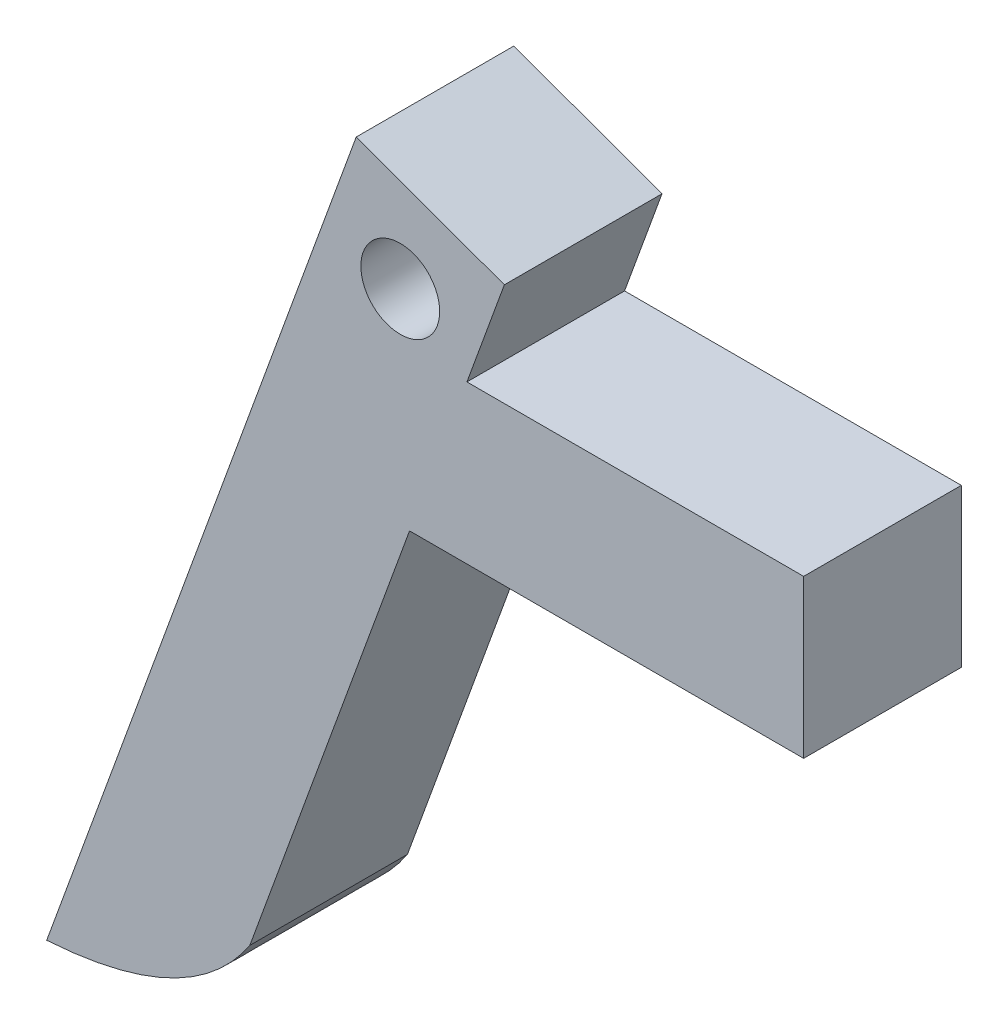
ISO-10303-21;
HEADER;
FILE_DESCRIPTION(('STEP AP214'),'2;1');
FILE_NAME('part.step','',(''),(''),'','','');
FILE_SCHEMA(('AUTOMOTIVE_DESIGN { 1 0 10303 214 1 1 1 1 }'));
ENDSEC;
DATA;
#1=APPLICATION_CONTEXT('core data for automotive mechanical design processes');
#2=APPLICATION_PROTOCOL_DEFINITION('international standard','automotive_design',2000,#1);
#3=PRODUCT_CONTEXT('',#1,'mechanical');
#4=PRODUCT('Part','Part','',(#3));
#5=PRODUCT_RELATED_PRODUCT_CATEGORY('part','',(#4));
#6=PRODUCT_DEFINITION_FORMATION('','',#4);
#7=PRODUCT_DEFINITION_CONTEXT('part definition',#1,'design');
#8=PRODUCT_DEFINITION('design','',#6,#7);
#9=PRODUCT_DEFINITION_SHAPE('','',#8);
#10=(LENGTH_UNIT() NAMED_UNIT(*) SI_UNIT(.MILLI.,.METRE.));
#11=(NAMED_UNIT(*) PLANE_ANGLE_UNIT() SI_UNIT($,.RADIAN.));
#12=(NAMED_UNIT(*) SI_UNIT($,.STERADIAN.) SOLID_ANGLE_UNIT());
#13=UNCERTAINTY_MEASURE_WITH_UNIT(LENGTH_MEASURE(1.E-05),#10,'distance_accuracy_value','');
#14=(GEOMETRIC_REPRESENTATION_CONTEXT(3) GLOBAL_UNCERTAINTY_ASSIGNED_CONTEXT((#13)) GLOBAL_UNIT_ASSIGNED_CONTEXT((#10,
#11,#12)) REPRESENTATION_CONTEXT('',''));
#15=CARTESIAN_POINT('',(0.,0.,0.));
#16=DIRECTION('',(0.,0.,1.));
#17=DIRECTION('',(1.,0.,0.));
#18=AXIS2_PLACEMENT_3D('',#15,#16,#17);
#19=CARTESIAN_POINT('',(-30.3249440941008,-32.1653689706177,10.));
#20=DIRECTION('',(0.,0.,-1.));
#21=DIRECTION('',(-1.,0.,0.));
#22=AXIS2_PLACEMENT_3D('',#19,#20,#21);
#23=PLANE('',#22);
#24=DIRECTION('',(0.,1.,0.));
#25=VECTOR('',#24,1.);
#26=CARTESIAN_POINT('',(9.87760816382358,0.,10.));
#27=LINE('',#26,#25);
#28=CARTESIAN_POINT('',(9.87760816382358,0.,10.));
#29=VERTEX_POINT('',#28);
#30=CARTESIAN_POINT('',(9.87760816382358,10.,10.));
#31=VERTEX_POINT('',#30);
#32=EDGE_CURVE('E187',#29,#31,#27,.T.);
#33=ORIENTED_EDGE('',*,*,#32,.T.);
#34=DIRECTION('',(-1.,0.,0.));
#35=VECTOR('',#34,1.);
#36=CARTESIAN_POINT('',(9.87760816382358,10.,10.));
#37=LINE('',#36,#35);
#38=CARTESIAN_POINT('',(-11.4826894935144,10.,10.));
#39=VERTEX_POINT('',#38);
#40=EDGE_CURVE('E124',#31,#39,#37,.T.);
#41=ORIENTED_EDGE('',*,*,#40,.T.);
#42=DIRECTION('',(0.342020143325665,0.93969262078591,0.));
#43=VECTOR('',#42,1.);
#44=CARTESIAN_POINT('',(-11.4826894935144,10.,10.));
#45=LINE('',#44,#43);
#46=CARTESIAN_POINT('',(-9.10833293386977,16.5234910333578,10.));
#47=VERTEX_POINT('',#46);
#48=EDGE_CURVE('E200',#39,#47,#45,.T.);
#49=ORIENTED_EDGE('',*,*,#48,.T.);
#50=DIRECTION('',(0.93969262078591,-0.342020143325665,0.));
#51=VECTOR('',#50,1.);
#52=CARTESIAN_POINT('',(-18.5052591417289,19.9436924666144,10.));
#53=LINE('',#52,#51);
#54=CARTESIAN_POINT('',(-18.5052591417289,19.9436924666144,10.));
#55=VERTEX_POINT('',#54);
#56=EDGE_CURVE('E210',#55,#47,#53,.T.);
#57=ORIENTED_EDGE('',*,*,#56,.F.);
#58=DIRECTION('',(-0.342020143325665,-0.939692620785909,0.));
#59=VECTOR('',#58,1.);
#60=CARTESIAN_POINT('',(-18.5052591417289,19.9436924666144,10.));
#61=LINE('',#60,#59);
#62=CARTESIAN_POINT('',(-38.1391575259863,-34.,10.));
#63=VERTEX_POINT('',#62);
#64=EDGE_CURVE('E144',#55,#63,#61,.T.);
#65=ORIENTED_EDGE('',*,*,#64,.T.);
#66=CARTESIAN_POINT('',(-38.1391575259863,-34.,10.));
#67=CARTESIAN_POINT('',(-28.952640901572,-33.4107188612063,10.));
#68=CARTESIAN_POINT('',(-25.2553370472728,-27.8400381600583,10.));
#69=B_SPLINE_CURVE_WITH_KNOTS('',2,(#66,#67,#68),.UNSPECIFIED.,.F.,.F.,(3,3),(0.,
0.686191172610155),.UNSPECIFIED.);
#70=CARTESIAN_POINT('',(-25.2553370472728,-27.8400381600583,10.));
#71=VERTEX_POINT('',#70);
#72=EDGE_CURVE('E137',#63,#71,#69,.T.);
#73=ORIENTED_EDGE('',*,*,#72,.T.);
#74=DIRECTION('',(0.342020143325666,0.939692620785909,0.));
#75=VECTOR('',#74,1.);
#76=CARTESIAN_POINT('',(-25.2553370472728,-27.8400381600583,10.));
#77=LINE('',#76,#75);
#78=CARTESIAN_POINT('',(-15.1223918361764,0.,10.));
#79=VERTEX_POINT('',#78);
#80=EDGE_CURVE('E141',#71,#79,#77,.T.);
#81=ORIENTED_EDGE('',*,*,#80,.T.);
#82=DIRECTION('',(1.,0.,0.));
#83=VECTOR('',#82,1.);
#84=CARTESIAN_POINT('',(-15.1223918361764,0.,10.));
#85=LINE('',#84,#83);
#86=EDGE_CURVE('E81',#79,#29,#85,.T.);
#87=ORIENTED_EDGE('',*,*,#86,.T.);
#88=EDGE_LOOP('',(#33,#41,#49,#57,#65,#73,#81,#87));
#89=FACE_BOUND('',#88,.T.);
#90=CARTESIAN_POINT('',(-15.7116676530954,13.,10.));
#91=DIRECTION('',(0.,0.,1.));
#92=DIRECTION('',(1.,0.,0.));
#93=AXIS2_PLACEMENT_3D('',#90,#91,#92);
#94=CIRCLE('',#93,2.5);
#95=CARTESIAN_POINT('',(-13.2116676530954,13.,10.));
#96=VERTEX_POINT('',#95);
#97=EDGE_CURVE('E169',#96,#96,#94,.T.);
#98=ORIENTED_EDGE('',*,*,#97,.F.);
#99=EDGE_LOOP('',(#98));
#100=FACE_BOUND('',#99,.T.);
#101=ADVANCED_FACE('F64',(#89,#100),#23,.F.);
#102=CARTESIAN_POINT('',(-30.3249440941008,-32.1653689706177,0.));
#103=DIRECTION('',(0.,0.,-1.));
#104=DIRECTION('',(-1.,0.,0.));
#105=AXIS2_PLACEMENT_3D('',#102,#103,#104);
#106=PLANE('',#105);
#107=DIRECTION('',(0.,1.,0.));
#108=VECTOR('',#107,1.);
#109=CARTESIAN_POINT('',(9.87760816382358,0.,0.));
#110=LINE('',#109,#108);
#111=CARTESIAN_POINT('',(9.87760816382358,0.,0.));
#112=VERTEX_POINT('',#111);
#113=CARTESIAN_POINT('',(9.87760816382358,10.,0.));
#114=VERTEX_POINT('',#113);
#115=EDGE_CURVE('E165',#112,#114,#110,.T.);
#116=ORIENTED_EDGE('',*,*,#115,.F.);
#117=DIRECTION('',(1.,0.,0.));
#118=VECTOR('',#117,1.);
#119=CARTESIAN_POINT('',(-15.1223918361764,0.,0.));
#120=LINE('',#119,#118);
#121=CARTESIAN_POINT('',(-15.1223918361764,0.,0.));
#122=VERTEX_POINT('',#121);
#123=EDGE_CURVE('E116',#122,#112,#120,.T.);
#124=ORIENTED_EDGE('',*,*,#123,.F.);
#125=DIRECTION('',(0.342020143325666,0.939692620785909,0.));
#126=VECTOR('',#125,1.);
#127=CARTESIAN_POINT('',(-25.2553370472728,-27.8400381600583,0.));
#128=LINE('',#127,#126);
#129=CARTESIAN_POINT('',(-25.2553370472728,-27.8400381600583,0.));
#130=VERTEX_POINT('',#129);
#131=EDGE_CURVE('E110',#130,#122,#128,.T.);
#132=ORIENTED_EDGE('',*,*,#131,.F.);
#133=CARTESIAN_POINT('',(-38.1391575259863,-34.,0.));
#134=CARTESIAN_POINT('',(-28.952640901572,-33.4107188612063,0.));
#135=CARTESIAN_POINT('',(-25.2553370472728,-27.8400381600583,0.));
#136=B_SPLINE_CURVE_WITH_KNOTS('',2,(#133,#134,#135),.UNSPECIFIED.,.F.,.F.,(3,3),(0.,
0.686191172610155),.UNSPECIFIED.);
#137=CARTESIAN_POINT('',(-38.1391575259863,-34.,0.));
#138=VERTEX_POINT('',#137);
#139=EDGE_CURVE('E152',#138,#130,#136,.T.);
#140=ORIENTED_EDGE('',*,*,#139,.F.);
#141=DIRECTION('',(-0.342020143325665,-0.939692620785909,0.));
#142=VECTOR('',#141,1.);
#143=CARTESIAN_POINT('',(-18.5052591417289,19.9436924666144,0.));
#144=LINE('',#143,#142);
#145=CARTESIAN_POINT('',(-18.5052591417289,19.9436924666144,0.));
#146=VERTEX_POINT('',#145);
#147=EDGE_CURVE('E177',#146,#138,#144,.T.);
#148=ORIENTED_EDGE('',*,*,#147,.F.);
#149=DIRECTION('',(0.93969262078591,-0.342020143325665,0.));
#150=VECTOR('',#149,1.);
#151=CARTESIAN_POINT('',(-18.5052591417289,19.9436924666144,0.));
#152=LINE('',#151,#150);
#153=CARTESIAN_POINT('',(-9.10833293386977,16.5234910333578,0.));
#154=VERTEX_POINT('',#153);
#155=EDGE_CURVE('E174',#146,#154,#152,.T.);
#156=ORIENTED_EDGE('',*,*,#155,.T.);
#157=DIRECTION('',(0.342020143325665,0.93969262078591,0.));
#158=VECTOR('',#157,1.);
#159=CARTESIAN_POINT('',(-11.4826894935144,10.,0.));
#160=LINE('',#159,#158);
#161=CARTESIAN_POINT('',(-11.4826894935144,10.,0.));
#162=VERTEX_POINT('',#161);
#163=EDGE_CURVE('E171',#162,#154,#160,.T.);
#164=ORIENTED_EDGE('',*,*,#163,.F.);
#165=DIRECTION('',(-1.,0.,0.));
#166=VECTOR('',#165,1.);
#167=CARTESIAN_POINT('',(9.87760816382358,10.,0.));
#168=LINE('',#167,#166);
#169=EDGE_CURVE('E168',#114,#162,#168,.T.);
#170=ORIENTED_EDGE('',*,*,#169,.F.);
#171=EDGE_LOOP('',(#116,#124,#132,#140,#148,#156,#164,#170));
#172=FACE_BOUND('',#171,.T.);
#173=CARTESIAN_POINT('',(-15.7116676530954,13.,0.));
#174=DIRECTION('',(0.,0.,1.));
#175=DIRECTION('',(1.,0.,0.));
#176=AXIS2_PLACEMENT_3D('',#173,#174,#175);
#177=CIRCLE('',#176,2.5);
#178=CARTESIAN_POINT('',(-13.2116676530954,13.,0.));
#179=VERTEX_POINT('',#178);
#180=EDGE_CURVE('E216',#179,#179,#177,.T.);
#181=ORIENTED_EDGE('',*,*,#180,.T.);
#182=EDGE_LOOP('',(#181));
#183=FACE_BOUND('',#182,.T.);
#184=ADVANCED_FACE('F203',(#172,#183),#106,.T.);
#185=CARTESIAN_POINT('',(9.87760816382358,0.,10.));
#186=DIRECTION('',(-1.,0.,0.));
#187=DIRECTION('',(0.,-1.,0.));
#188=AXIS2_PLACEMENT_3D('',#185,#186,#187);
#189=PLANE('',#188);
#190=ORIENTED_EDGE('',*,*,#115,.T.);
#191=DIRECTION('',(0.,0.,-1.));
#192=VECTOR('',#191,1.);
#193=CARTESIAN_POINT('',(9.87760816382358,10.,10.));
#194=LINE('',#193,#192);
#195=EDGE_CURVE('E12',#31,#114,#194,.T.);
#196=ORIENTED_EDGE('',*,*,#195,.F.);
#197=ORIENTED_EDGE('',*,*,#32,.F.);
#198=DIRECTION('',(0.,0.,-1.));
#199=VECTOR('',#198,1.);
#200=CARTESIAN_POINT('',(9.87760816382358,0.,10.));
#201=LINE('',#200,#199);
#202=EDGE_CURVE('E158',#29,#112,#201,.T.);
#203=ORIENTED_EDGE('',*,*,#202,.T.);
#204=EDGE_LOOP('',(#190,#196,#197,#203));
#205=FACE_BOUND('',#204,.T.);
#206=ADVANCED_FACE('F66',(#205),#189,.F.);
#207=CARTESIAN_POINT('',(9.87760816382358,10.,10.));
#208=DIRECTION('',(0.,-1.,0.));
#209=DIRECTION('',(0.,0.,-1.));
#210=AXIS2_PLACEMENT_3D('',#207,#208,#209);
#211=PLANE('',#210);
#212=ORIENTED_EDGE('',*,*,#169,.T.);
#213=DIRECTION('',(0.,0.,-1.));
#214=VECTOR('',#213,1.);
#215=CARTESIAN_POINT('',(-11.4826894935144,10.,10.));
#216=LINE('',#215,#214);
#217=EDGE_CURVE('E73',#39,#162,#216,.T.);
#218=ORIENTED_EDGE('',*,*,#217,.F.);
#219=ORIENTED_EDGE('',*,*,#40,.F.);
#220=ORIENTED_EDGE('',*,*,#195,.T.);
#221=EDGE_LOOP('',(#212,#218,#219,#220));
#222=FACE_BOUND('',#221,.T.);
#223=ADVANCED_FACE('F246',(#222),#211,.F.);
#224=CARTESIAN_POINT('',(-11.4826894935144,10.,10.));
#225=DIRECTION('',(-0.93969262078591,0.342020143325665,0.));
#226=DIRECTION('',(-0.342020143325665,-0.93969262078591,0.));
#227=AXIS2_PLACEMENT_3D('',#224,#225,#226);
#228=PLANE('',#227);
#229=ORIENTED_EDGE('',*,*,#163,.T.);
#230=DIRECTION('',(0.,0.,-1.));
#231=VECTOR('',#230,1.);
#232=CARTESIAN_POINT('',(-9.10833293386977,16.5234910333578,10.));
#233=LINE('',#232,#231);
#234=EDGE_CURVE('E193',#47,#154,#233,.T.);
#235=ORIENTED_EDGE('',*,*,#234,.F.);
#236=ORIENTED_EDGE('',*,*,#48,.F.);
#237=ORIENTED_EDGE('',*,*,#217,.T.);
#238=EDGE_LOOP('',(#229,#235,#236,#237));
#239=FACE_BOUND('',#238,.T.);
#240=ADVANCED_FACE('F198',(#239),#228,.F.);
#241=CARTESIAN_POINT('',(-18.5052591417289,19.9436924666144,10.));
#242=DIRECTION('',(0.342020143325665,0.93969262078591,0.));
#243=DIRECTION('',(-0.93969262078591,0.342020143325665,0.));
#244=AXIS2_PLACEMENT_3D('',#241,#242,#243);
#245=PLANE('',#244);
#246=ORIENTED_EDGE('',*,*,#155,.F.);
#247=DIRECTION('',(0.,0.,-1.));
#248=VECTOR('',#247,1.);
#249=CARTESIAN_POINT('',(-18.5052591417289,19.9436924666144,10.));
#250=LINE('',#249,#248);
#251=EDGE_CURVE('E191',#55,#146,#250,.T.);
#252=ORIENTED_EDGE('',*,*,#251,.F.);
#253=ORIENTED_EDGE('',*,*,#56,.T.);
#254=ORIENTED_EDGE('',*,*,#234,.T.);
#255=EDGE_LOOP('',(#246,#252,#253,#254));
#256=FACE_BOUND('',#255,.T.);
#257=ADVANCED_FACE('F208',(#256),#245,.T.);
#258=CARTESIAN_POINT('',(-18.5052591417289,19.9436924666144,10.));
#259=DIRECTION('',(0.93969262078591,-0.342020143325666,0.));
#260=DIRECTION('',(0.342020143325666,0.93969262078591,0.));
#261=AXIS2_PLACEMENT_3D('',#258,#259,#260);
#262=PLANE('',#261);
#263=ORIENTED_EDGE('',*,*,#147,.T.);
#264=DIRECTION('',(0.,0.,-1.));
#265=VECTOR('',#264,1.);
#266=CARTESIAN_POINT('',(-38.1391575259863,-34.,10.));
#267=LINE('',#266,#265);
#268=EDGE_CURVE('E153',#63,#138,#267,.T.);
#269=ORIENTED_EDGE('',*,*,#268,.F.);
#270=ORIENTED_EDGE('',*,*,#64,.F.);
#271=ORIENTED_EDGE('',*,*,#251,.T.);
#272=EDGE_LOOP('',(#263,#269,#270,#271));
#273=FACE_BOUND('',#272,.T.);
#274=ADVANCED_FACE('F239',(#273),#262,.F.);
#275=DIRECTION('',(0.,0.,-1.));
#276=VECTOR('',#275,1.);
#277=SURFACE_OF_LINEAR_EXTRUSION('',#69,#276);
#278=ORIENTED_EDGE('',*,*,#139,.T.);
#279=DIRECTION('',(0.,0.,-1.));
#280=VECTOR('',#279,1.);
#281=CARTESIAN_POINT('',(-25.2553370472728,-27.8400381600583,10.));
#282=LINE('',#281,#280);
#283=EDGE_CURVE('E149',#71,#130,#282,.T.);
#284=ORIENTED_EDGE('',*,*,#283,.F.);
#285=ORIENTED_EDGE('',*,*,#72,.F.);
#286=ORIENTED_EDGE('',*,*,#268,.T.);
#287=EDGE_LOOP('',(#278,#284,#285,#286));
#288=FACE_BOUND('',#287,.T.);
#289=ADVANCED_FACE('F150',(#288),#277,.F.);
#290=CARTESIAN_POINT('',(-25.2553370472728,-27.8400381600583,10.));
#291=DIRECTION('',(-0.93969262078591,0.342020143325666,0.));
#292=DIRECTION('',(-0.342020143325666,-0.93969262078591,0.));
#293=AXIS2_PLACEMENT_3D('',#290,#291,#292);
#294=PLANE('',#293);
#295=ORIENTED_EDGE('',*,*,#131,.T.);
#296=DIRECTION('',(0.,0.,-1.));
#297=VECTOR('',#296,1.);
#298=CARTESIAN_POINT('',(-15.1223918361764,0.,10.));
#299=LINE('',#298,#297);
#300=EDGE_CURVE('E154',#79,#122,#299,.T.);
#301=ORIENTED_EDGE('',*,*,#300,.F.);
#302=ORIENTED_EDGE('',*,*,#80,.F.);
#303=ORIENTED_EDGE('',*,*,#283,.T.);
#304=EDGE_LOOP('',(#295,#301,#302,#303));
#305=FACE_BOUND('',#304,.T.);
#306=ADVANCED_FACE('F156',(#305),#294,.F.);
#307=CARTESIAN_POINT('',(-15.1223918361764,0.,10.));
#308=DIRECTION('',(0.,1.,0.));
#309=DIRECTION('',(0.,0.,1.));
#310=AXIS2_PLACEMENT_3D('',#307,#308,#309);
#311=PLANE('',#310);
#312=ORIENTED_EDGE('',*,*,#123,.T.);
#313=ORIENTED_EDGE('',*,*,#202,.F.);
#314=ORIENTED_EDGE('',*,*,#86,.F.);
#315=ORIENTED_EDGE('',*,*,#300,.T.);
#316=EDGE_LOOP('',(#312,#313,#314,#315));
#317=FACE_BOUND('',#316,.T.);
#318=ADVANCED_FACE('F232',(#317),#311,.F.);
#319=CARTESIAN_POINT('',(-15.7116676530954,13.,10.));
#320=DIRECTION('',(0.,0.,-1.));
#321=DIRECTION('',(-1.,0.,0.));
#322=AXIS2_PLACEMENT_3D('',#319,#320,#321);
#323=CYLINDRICAL_SURFACE('',#322,2.5);
#324=ORIENTED_EDGE('',*,*,#97,.T.);
#325=EDGE_LOOP('',(#324));
#326=FACE_BOUND('',#325,.T.);
#327=ORIENTED_EDGE('',*,*,#180,.F.);
#328=EDGE_LOOP('',(#327));
#329=FACE_BOUND('',#328,.T.);
#330=ADVANCED_FACE('F222',(#326,#329),#323,.F.);
#331=CLOSED_SHELL('',(#101,#184,#206,#223,#240,#257,#274,#289,#306,#318,#330));
#332=MANIFOLD_SOLID_BREP('B2',#331);
#333=ADVANCED_BREP_SHAPE_REPRESENTATION('',(#18,#332),#14);
#334=SHAPE_DEFINITION_REPRESENTATION(#9,#333);
ENDSEC;
END-ISO-10303-21;
